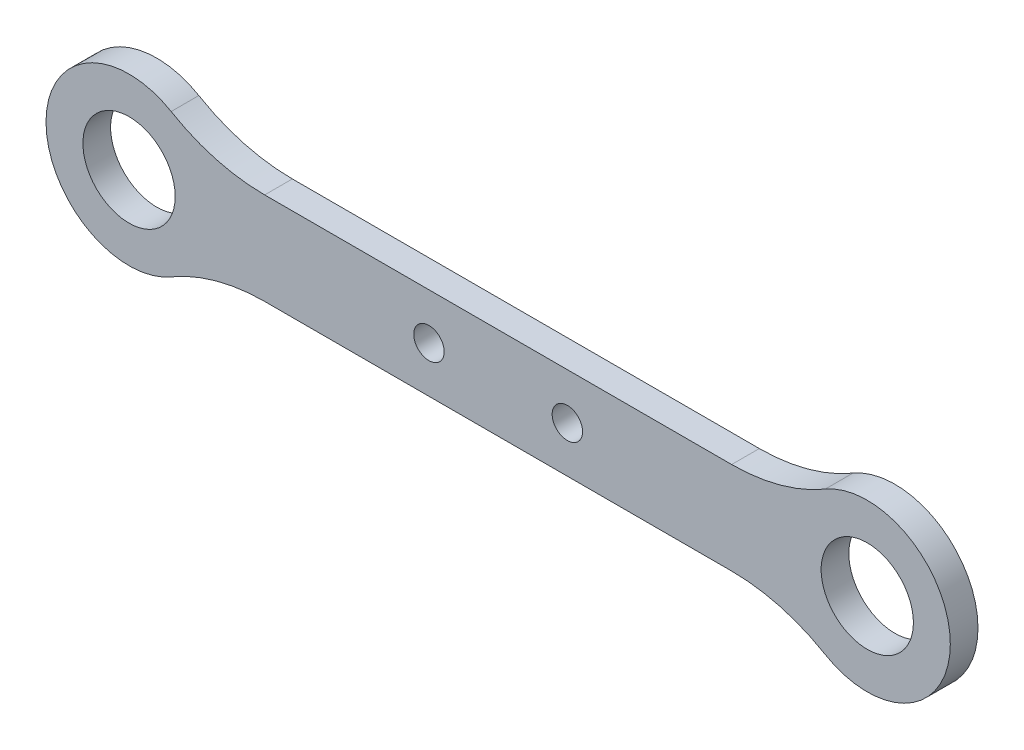
ISO-10303-21;
HEADER;
FILE_DESCRIPTION(('STEP AP214'),'2;1');
FILE_NAME('part.step','',(''),(''),'','','');
FILE_SCHEMA(('AUTOMOTIVE_DESIGN { 1 0 10303 214 1 1 1 1 }'));
ENDSEC;
DATA;
#1=APPLICATION_CONTEXT('core data for automotive mechanical design processes');
#2=APPLICATION_PROTOCOL_DEFINITION('international standard','automotive_design',2000,#1);
#3=PRODUCT_CONTEXT('',#1,'mechanical');
#4=PRODUCT('Part','Part','',(#3));
#5=PRODUCT_RELATED_PRODUCT_CATEGORY('part','',(#4));
#6=PRODUCT_DEFINITION_FORMATION('','',#4);
#7=PRODUCT_DEFINITION_CONTEXT('part definition',#1,'design');
#8=PRODUCT_DEFINITION('design','',#6,#7);
#9=PRODUCT_DEFINITION_SHAPE('','',#8);
#10=(LENGTH_UNIT() NAMED_UNIT(*) SI_UNIT(.MILLI.,.METRE.));
#11=(NAMED_UNIT(*) PLANE_ANGLE_UNIT() SI_UNIT($,.RADIAN.));
#12=(NAMED_UNIT(*) SI_UNIT($,.STERADIAN.) SOLID_ANGLE_UNIT());
#13=UNCERTAINTY_MEASURE_WITH_UNIT(LENGTH_MEASURE(1.E-05),#10,'distance_accuracy_value','');
#14=(GEOMETRIC_REPRESENTATION_CONTEXT(3) GLOBAL_UNCERTAINTY_ASSIGNED_CONTEXT((#13)) GLOBAL_UNIT_ASSIGNED_CONTEXT((#10,
#11,#12)) REPRESENTATION_CONTEXT('',''));
#15=CARTESIAN_POINT('',(0.,0.,0.));
#16=DIRECTION('',(0.,0.,1.));
#17=DIRECTION('',(1.,0.,0.));
#18=AXIS2_PLACEMENT_3D('',#15,#16,#17);
#19=CARTESIAN_POINT('',(80.,0.,3.));
#20=DIRECTION('',(0.,0.,-1.));
#21=DIRECTION('',(-1.,0.,0.));
#22=AXIS2_PLACEMENT_3D('',#19,#20,#21);
#23=CYLINDRICAL_SURFACE('',#22,9.);
#24=CARTESIAN_POINT('',(80.,0.,3.));
#25=DIRECTION('',(0.,0.,1.));
#26=DIRECTION('',(1.,0.,0.));
#27=AXIS2_PLACEMENT_3D('',#24,#25,#26);
#28=CIRCLE('',#27,9.);
#29=CARTESIAN_POINT('',(75.4388811686106,7.75862068965518,3.));
#30=VERTEX_POINT('',#29);
#31=CARTESIAN_POINT('',(75.4388811686106,-7.75862068965518,3.));
#32=VERTEX_POINT('',#31);
#33=EDGE_CURVE('E148',#30,#32,#28,.F.);
#34=ORIENTED_EDGE('',*,*,#33,.T.);
#35=DIRECTION('',(0.,0.,-1.));
#36=VECTOR('',#35,1.);
#37=CARTESIAN_POINT('',(75.4388811686106,-7.75862068965518,3.));
#38=LINE('',#37,#36);
#39=CARTESIAN_POINT('',(75.4388811686106,-7.75862068965518,0.));
#40=VERTEX_POINT('',#39);
#41=EDGE_CURVE('E156',#32,#40,#38,.T.);
#42=ORIENTED_EDGE('',*,*,#41,.T.);
#43=CARTESIAN_POINT('',(80.,0.,0.));
#44=DIRECTION('',(0.,0.,1.));
#45=DIRECTION('',(1.,0.,0.));
#46=AXIS2_PLACEMENT_3D('',#43,#44,#45);
#47=CIRCLE('',#46,9.);
#48=CARTESIAN_POINT('',(75.4388811686106,7.75862068965518,0.));
#49=VERTEX_POINT('',#48);
#50=EDGE_CURVE('E172',#49,#40,#47,.F.);
#51=ORIENTED_EDGE('',*,*,#50,.F.);
#52=DIRECTION('',(0.,0.,-1.));
#53=VECTOR('',#52,1.);
#54=CARTESIAN_POINT('',(75.4388811686106,7.75862068965518,3.));
#55=LINE('',#54,#53);
#56=EDGE_CURVE('E154',#49,#30,#55,.F.);
#57=ORIENTED_EDGE('',*,*,#56,.T.);
#58=EDGE_LOOP('',(#34,#42,#51,#57));
#59=FACE_BOUND('',#58,.T.);
#60=ADVANCED_FACE('F35',(#59),#23,.T.);
#61=CARTESIAN_POINT('',(0.,4.99999999999999,3.));
#62=DIRECTION('',(0.,1.,0.));
#63=DIRECTION('',(-1.,0.,0.));
#64=AXIS2_PLACEMENT_3D('',#61,#62,#63);
#65=PLANE('',#64);
#66=DIRECTION('',(1.,0.,0.));
#67=VECTOR('',#66,1.);
#68=CARTESIAN_POINT('',(0.,4.99999999999999,3.));
#69=LINE('',#68,#67);
#70=CARTESIAN_POINT('',(14.6969384566991,4.99999999999999,3.));
#71=VERTEX_POINT('',#70);
#72=CARTESIAN_POINT('',(65.3030615433009,5.,3.));
#73=VERTEX_POINT('',#72);
#74=EDGE_CURVE('E179',#71,#73,#69,.T.);
#75=ORIENTED_EDGE('',*,*,#74,.T.);
#76=DIRECTION('',(0.,0.,1.));
#77=VECTOR('',#76,1.);
#78=CARTESIAN_POINT('',(65.3030615433009,5.,0.));
#79=LINE('',#78,#77);
#80=CARTESIAN_POINT('',(65.3030615433009,5.,0.));
#81=VERTEX_POINT('',#80);
#82=EDGE_CURVE('E112',#73,#81,#79,.F.);
#83=ORIENTED_EDGE('',*,*,#82,.T.);
#84=DIRECTION('',(1.,0.,0.));
#85=VECTOR('',#84,1.);
#86=CARTESIAN_POINT('',(0.,4.99999999999999,0.));
#87=LINE('',#86,#85);
#88=CARTESIAN_POINT('',(14.6969384566991,4.99999999999999,0.));
#89=VERTEX_POINT('',#88);
#90=EDGE_CURVE('E136',#89,#81,#87,.T.);
#91=ORIENTED_EDGE('',*,*,#90,.F.);
#92=DIRECTION('',(0.,0.,-1.));
#93=VECTOR('',#92,1.);
#94=CARTESIAN_POINT('',(14.6969384566991,4.99999999999999,3.));
#95=LINE('',#94,#93);
#96=EDGE_CURVE('E57',#89,#71,#95,.F.);
#97=ORIENTED_EDGE('',*,*,#96,.T.);
#98=EDGE_LOOP('',(#75,#83,#91,#97));
#99=FACE_BOUND('',#98,.T.);
#100=ADVANCED_FACE('F170',(#99),#65,.T.);
#101=CARTESIAN_POINT('',(0.,0.,3.));
#102=DIRECTION('',(0.,0.,-1.));
#103=DIRECTION('',(-1.,0.,0.));
#104=AXIS2_PLACEMENT_3D('',#101,#102,#103);
#105=CYLINDRICAL_SURFACE('',#104,9.);
#106=CARTESIAN_POINT('',(0.,0.,0.));
#107=DIRECTION('',(0.,0.,1.));
#108=DIRECTION('',(1.,0.,0.));
#109=AXIS2_PLACEMENT_3D('',#106,#107,#108);
#110=CIRCLE('',#109,9.);
#111=CARTESIAN_POINT('',(4.56111883138937,7.75862068965517,0.));
#112=VERTEX_POINT('',#111);
#113=CARTESIAN_POINT('',(4.56111883138936,-7.75862068965518,0.));
#114=VERTEX_POINT('',#113);
#115=EDGE_CURVE('E131',#112,#114,#110,.T.);
#116=ORIENTED_EDGE('',*,*,#115,.T.);
#117=DIRECTION('',(0.,0.,-1.));
#118=VECTOR('',#117,1.);
#119=CARTESIAN_POINT('',(4.56111883138936,-7.75862068965518,3.));
#120=LINE('',#119,#118);
#121=CARTESIAN_POINT('',(4.56111883138936,-7.75862068965518,3.));
#122=VERTEX_POINT('',#121);
#123=EDGE_CURVE('E106',#114,#122,#120,.F.);
#124=ORIENTED_EDGE('',*,*,#123,.T.);
#125=CARTESIAN_POINT('',(0.,0.,3.));
#126=DIRECTION('',(0.,0.,1.));
#127=DIRECTION('',(1.,0.,0.));
#128=AXIS2_PLACEMENT_3D('',#125,#126,#127);
#129=CIRCLE('',#128,9.);
#130=CARTESIAN_POINT('',(4.56111883138937,7.75862068965517,3.));
#131=VERTEX_POINT('',#130);
#132=EDGE_CURVE('E178',#131,#122,#129,.T.);
#133=ORIENTED_EDGE('',*,*,#132,.F.);
#134=DIRECTION('',(0.,0.,-1.));
#135=VECTOR('',#134,1.);
#136=CARTESIAN_POINT('',(4.56111883138937,7.75862068965517,3.));
#137=LINE('',#136,#135);
#138=EDGE_CURVE('E122',#131,#112,#137,.T.);
#139=ORIENTED_EDGE('',*,*,#138,.T.);
#140=EDGE_LOOP('',(#116,#124,#133,#139));
#141=FACE_BOUND('',#140,.T.);
#142=ADVANCED_FACE('F181',(#141),#105,.T.);
#143=CARTESIAN_POINT('',(47.5,0.,3.));
#144=DIRECTION('',(0.,0.,-1.));
#145=DIRECTION('',(-1.,0.,0.));
#146=AXIS2_PLACEMENT_3D('',#143,#144,#145);
#147=CYLINDRICAL_SURFACE('',#146,1.65);
#148=CARTESIAN_POINT('',(47.5,0.,3.));
#149=DIRECTION('',(0.,0.,1.));
#150=DIRECTION('',(1.,0.,0.));
#151=AXIS2_PLACEMENT_3D('',#148,#149,#150);
#152=CIRCLE('',#151,1.65);
#153=CARTESIAN_POINT('',(49.15,0.,3.));
#154=VERTEX_POINT('',#153);
#155=EDGE_CURVE('E193',#154,#154,#152,.T.);
#156=ORIENTED_EDGE('',*,*,#155,.T.);
#157=EDGE_LOOP('',(#156));
#158=FACE_BOUND('',#157,.T.);
#159=CARTESIAN_POINT('',(47.5,0.,0.));
#160=DIRECTION('',(0.,0.,1.));
#161=DIRECTION('',(1.,0.,0.));
#162=AXIS2_PLACEMENT_3D('',#159,#160,#161);
#163=CIRCLE('',#162,1.65);
#164=CARTESIAN_POINT('',(49.15,0.,0.));
#165=VERTEX_POINT('',#164);
#166=EDGE_CURVE('E142',#165,#165,#163,.T.);
#167=ORIENTED_EDGE('',*,*,#166,.F.);
#168=EDGE_LOOP('',(#167));
#169=FACE_BOUND('',#168,.T.);
#170=ADVANCED_FACE('F235',(#158,#169),#147,.F.);
#171=CARTESIAN_POINT('',(32.5,0.,3.));
#172=DIRECTION('',(0.,0.,-1.));
#173=DIRECTION('',(-1.,0.,0.));
#174=AXIS2_PLACEMENT_3D('',#171,#172,#173);
#175=CYLINDRICAL_SURFACE('',#174,1.65);
#176=CARTESIAN_POINT('',(32.5,0.,3.));
#177=DIRECTION('',(0.,0.,1.));
#178=DIRECTION('',(1.,0.,0.));
#179=AXIS2_PLACEMENT_3D('',#176,#177,#178);
#180=CIRCLE('',#179,1.65);
#181=CARTESIAN_POINT('',(34.15,0.,3.));
#182=VERTEX_POINT('',#181);
#183=EDGE_CURVE('E190',#182,#182,#180,.T.);
#184=ORIENTED_EDGE('',*,*,#183,.T.);
#185=EDGE_LOOP('',(#184));
#186=FACE_BOUND('',#185,.T.);
#187=CARTESIAN_POINT('',(32.5,0.,0.));
#188=DIRECTION('',(0.,0.,1.));
#189=DIRECTION('',(1.,0.,0.));
#190=AXIS2_PLACEMENT_3D('',#187,#188,#189);
#191=CIRCLE('',#190,1.65);
#192=CARTESIAN_POINT('',(34.15,0.,0.));
#193=VERTEX_POINT('',#192);
#194=EDGE_CURVE('E134',#193,#193,#191,.T.);
#195=ORIENTED_EDGE('',*,*,#194,.F.);
#196=EDGE_LOOP('',(#195));
#197=FACE_BOUND('',#196,.T.);
#198=ADVANCED_FACE('F238',(#186,#197),#175,.F.);
#199=CARTESIAN_POINT('',(0.,0.,3.));
#200=DIRECTION('',(0.,0.,-1.));
#201=DIRECTION('',(-1.,0.,0.));
#202=AXIS2_PLACEMENT_3D('',#199,#200,#201);
#203=CYLINDRICAL_SURFACE('',#202,5.);
#204=CARTESIAN_POINT('',(0.,0.,3.));
#205=DIRECTION('',(0.,0.,1.));
#206=DIRECTION('',(1.,0.,0.));
#207=AXIS2_PLACEMENT_3D('',#204,#205,#206);
#208=CIRCLE('',#207,5.);
#209=CARTESIAN_POINT('',(5.,0.,3.));
#210=VERTEX_POINT('',#209);
#211=EDGE_CURVE('E183',#210,#210,#208,.T.);
#212=ORIENTED_EDGE('',*,*,#211,.T.);
#213=EDGE_LOOP('',(#212));
#214=FACE_BOUND('',#213,.T.);
#215=CARTESIAN_POINT('',(0.,0.,0.));
#216=DIRECTION('',(0.,0.,1.));
#217=DIRECTION('',(1.,0.,0.));
#218=AXIS2_PLACEMENT_3D('',#215,#216,#217);
#219=CIRCLE('',#218,5.);
#220=CARTESIAN_POINT('',(5.,0.,0.));
#221=VERTEX_POINT('',#220);
#222=EDGE_CURVE('E130',#221,#221,#219,.T.);
#223=ORIENTED_EDGE('',*,*,#222,.F.);
#224=EDGE_LOOP('',(#223));
#225=FACE_BOUND('',#224,.T.);
#226=ADVANCED_FACE('F242',(#214,#225),#203,.F.);
#227=CARTESIAN_POINT('',(0.,-5.00000000000001,3.));
#228=DIRECTION('',(0.,1.,0.));
#229=DIRECTION('',(-1.,0.,0.));
#230=AXIS2_PLACEMENT_3D('',#227,#228,#229);
#231=PLANE('',#230);
#232=DIRECTION('',(1.,0.,0.));
#233=VECTOR('',#232,1.);
#234=CARTESIAN_POINT('',(0.,-5.00000000000001,3.));
#235=LINE('',#234,#233);
#236=CARTESIAN_POINT('',(14.696938456699,-5.00000000000001,3.));
#237=VERTEX_POINT('',#236);
#238=CARTESIAN_POINT('',(65.3030615433009,-5.,3.));
#239=VERTEX_POINT('',#238);
#240=EDGE_CURVE('E121',#237,#239,#235,.T.);
#241=ORIENTED_EDGE('',*,*,#240,.F.);
#242=DIRECTION('',(0.,0.,1.));
#243=VECTOR('',#242,1.);
#244=CARTESIAN_POINT('',(14.696938456699,-5.00000000000001,0.));
#245=LINE('',#244,#243);
#246=CARTESIAN_POINT('',(14.696938456699,-5.00000000000001,0.));
#247=VERTEX_POINT('',#246);
#248=EDGE_CURVE('E105',#237,#247,#245,.F.);
#249=ORIENTED_EDGE('',*,*,#248,.T.);
#250=DIRECTION('',(1.,0.,0.));
#251=VECTOR('',#250,1.);
#252=CARTESIAN_POINT('',(0.,-5.00000000000001,0.));
#253=LINE('',#252,#251);
#254=CARTESIAN_POINT('',(65.3030615433009,-5.,0.));
#255=VERTEX_POINT('',#254);
#256=EDGE_CURVE('E118',#247,#255,#253,.T.);
#257=ORIENTED_EDGE('',*,*,#256,.T.);
#258=DIRECTION('',(0.,0.,-1.));
#259=VECTOR('',#258,1.);
#260=CARTESIAN_POINT('',(65.3030615433009,-5.,3.));
#261=LINE('',#260,#259);
#262=EDGE_CURVE('E123',#255,#239,#261,.F.);
#263=ORIENTED_EDGE('',*,*,#262,.T.);
#264=EDGE_LOOP('',(#241,#249,#257,#263));
#265=FACE_BOUND('',#264,.T.);
#266=ADVANCED_FACE('F117',(#265),#231,.F.);
#267=CARTESIAN_POINT('',(80.,0.,3.));
#268=DIRECTION('',(0.,0.,-1.));
#269=DIRECTION('',(-1.,0.,0.));
#270=AXIS2_PLACEMENT_3D('',#267,#268,#269);
#271=CYLINDRICAL_SURFACE('',#270,5.);
#272=CARTESIAN_POINT('',(80.,0.,3.));
#273=DIRECTION('',(0.,0.,1.));
#274=DIRECTION('',(1.,0.,0.));
#275=AXIS2_PLACEMENT_3D('',#272,#273,#274);
#276=CIRCLE('',#275,5.);
#277=CARTESIAN_POINT('',(85.,0.,3.));
#278=VERTEX_POINT('',#277);
#279=EDGE_CURVE('E149',#278,#278,#276,.F.);
#280=ORIENTED_EDGE('',*,*,#279,.F.);
#281=EDGE_LOOP('',(#280));
#282=FACE_BOUND('',#281,.T.);
#283=CARTESIAN_POINT('',(80.,0.,0.));
#284=DIRECTION('',(0.,0.,1.));
#285=DIRECTION('',(1.,0.,0.));
#286=AXIS2_PLACEMENT_3D('',#283,#284,#285);
#287=CIRCLE('',#286,5.);
#288=CARTESIAN_POINT('',(85.,0.,0.));
#289=VERTEX_POINT('',#288);
#290=EDGE_CURVE('E145',#289,#289,#287,.F.);
#291=ORIENTED_EDGE('',*,*,#290,.T.);
#292=EDGE_LOOP('',(#291));
#293=FACE_BOUND('',#292,.T.);
#294=ADVANCED_FACE('F229',(#282,#293),#271,.F.);
#295=CARTESIAN_POINT('',(0.,0.,3.));
#296=DIRECTION('',(0.,0.,1.));
#297=DIRECTION('',(1.,0.,0.));
#298=AXIS2_PLACEMENT_3D('',#295,#296,#297);
#299=PLANE('',#298);
#300=ORIENTED_EDGE('',*,*,#33,.F.);
#301=CARTESIAN_POINT('',(65.3030615433009,25.,3.));
#302=DIRECTION('',(0.,0.,1.));
#303=DIRECTION('',(1.,0.,0.));
#304=AXIS2_PLACEMENT_3D('',#301,#302,#303);
#305=CIRCLE('',#304,20.);
#306=EDGE_CURVE('E50',#30,#73,#305,.F.);
#307=ORIENTED_EDGE('',*,*,#306,.T.);
#308=ORIENTED_EDGE('',*,*,#74,.F.);
#309=CARTESIAN_POINT('',(14.6969384566991,25.,3.));
#310=DIRECTION('',(0.,0.,1.));
#311=DIRECTION('',(1.,0.,0.));
#312=AXIS2_PLACEMENT_3D('',#309,#310,#311);
#313=CIRCLE('',#312,20.);
#314=EDGE_CURVE('E11',#71,#131,#313,.F.);
#315=ORIENTED_EDGE('',*,*,#314,.T.);
#316=ORIENTED_EDGE('',*,*,#132,.T.);
#317=CARTESIAN_POINT('',(14.6969384566991,-25.,3.));
#318=DIRECTION('',(0.,0.,1.));
#319=DIRECTION('',(1.,0.,0.));
#320=AXIS2_PLACEMENT_3D('',#317,#318,#319);
#321=CIRCLE('',#320,20.);
#322=EDGE_CURVE('E111',#122,#237,#321,.F.);
#323=ORIENTED_EDGE('',*,*,#322,.T.);
#324=ORIENTED_EDGE('',*,*,#240,.T.);
#325=CARTESIAN_POINT('',(65.3030615433009,-25.,3.));
#326=DIRECTION('',(0.,0.,1.));
#327=DIRECTION('',(1.,0.,0.));
#328=AXIS2_PLACEMENT_3D('',#325,#326,#327);
#329=CIRCLE('',#328,20.);
#330=EDGE_CURVE('E164',#239,#32,#329,.F.);
#331=ORIENTED_EDGE('',*,*,#330,.T.);
#332=EDGE_LOOP('',(#300,#307,#308,#315,#316,#323,#324,#331));
#333=FACE_BOUND('',#332,.T.);
#334=ORIENTED_EDGE('',*,*,#211,.F.);
#335=EDGE_LOOP('',(#334));
#336=FACE_BOUND('',#335,.T.);
#337=ORIENTED_EDGE('',*,*,#183,.F.);
#338=EDGE_LOOP('',(#337));
#339=FACE_BOUND('',#338,.T.);
#340=ORIENTED_EDGE('',*,*,#155,.F.);
#341=EDGE_LOOP('',(#340));
#342=FACE_BOUND('',#341,.T.);
#343=ORIENTED_EDGE('',*,*,#279,.T.);
#344=EDGE_LOOP('',(#343));
#345=FACE_BOUND('',#344,.T.);
#346=ADVANCED_FACE('F176',(#333,#336,#339,#342,#345),#299,.T.);
#347=CARTESIAN_POINT('',(0.,0.,0.));
#348=DIRECTION('',(0.,0.,1.));
#349=DIRECTION('',(1.,0.,0.));
#350=AXIS2_PLACEMENT_3D('',#347,#348,#349);
#351=PLANE('',#350);
#352=ORIENTED_EDGE('',*,*,#90,.T.);
#353=CARTESIAN_POINT('',(65.3030615433009,25.,0.));
#354=DIRECTION('',(0.,0.,1.));
#355=DIRECTION('',(1.,0.,0.));
#356=AXIS2_PLACEMENT_3D('',#353,#354,#355);
#357=CIRCLE('',#356,20.);
#358=EDGE_CURVE('E166',#81,#49,#357,.T.);
#359=ORIENTED_EDGE('',*,*,#358,.T.);
#360=ORIENTED_EDGE('',*,*,#50,.T.);
#361=CARTESIAN_POINT('',(65.3030615433009,-25.,0.));
#362=DIRECTION('',(0.,0.,1.));
#363=DIRECTION('',(1.,0.,0.));
#364=AXIS2_PLACEMENT_3D('',#361,#362,#363);
#365=CIRCLE('',#364,20.);
#366=EDGE_CURVE('E129',#40,#255,#365,.T.);
#367=ORIENTED_EDGE('',*,*,#366,.T.);
#368=ORIENTED_EDGE('',*,*,#256,.F.);
#369=CARTESIAN_POINT('',(14.6969384566991,-25.,0.));
#370=DIRECTION('',(0.,0.,1.));
#371=DIRECTION('',(1.,0.,0.));
#372=AXIS2_PLACEMENT_3D('',#369,#370,#371);
#373=CIRCLE('',#372,20.);
#374=EDGE_CURVE('E101',#247,#114,#373,.T.);
#375=ORIENTED_EDGE('',*,*,#374,.T.);
#376=ORIENTED_EDGE('',*,*,#115,.F.);
#377=CARTESIAN_POINT('',(14.6969384566991,25.,0.));
#378=DIRECTION('',(0.,0.,1.));
#379=DIRECTION('',(1.,0.,0.));
#380=AXIS2_PLACEMENT_3D('',#377,#378,#379);
#381=CIRCLE('',#380,20.);
#382=EDGE_CURVE('E43',#112,#89,#381,.T.);
#383=ORIENTED_EDGE('',*,*,#382,.T.);
#384=EDGE_LOOP('',(#352,#359,#360,#367,#368,#375,#376,#383));
#385=FACE_BOUND('',#384,.T.);
#386=ORIENTED_EDGE('',*,*,#222,.T.);
#387=EDGE_LOOP('',(#386));
#388=FACE_BOUND('',#387,.T.);
#389=ORIENTED_EDGE('',*,*,#194,.T.);
#390=EDGE_LOOP('',(#389));
#391=FACE_BOUND('',#390,.T.);
#392=ORIENTED_EDGE('',*,*,#166,.T.);
#393=EDGE_LOOP('',(#392));
#394=FACE_BOUND('',#393,.T.);
#395=ORIENTED_EDGE('',*,*,#290,.F.);
#396=EDGE_LOOP('',(#395));
#397=FACE_BOUND('',#396,.T.);
#398=ADVANCED_FACE('F126',(#385,#388,#391,#394,#397),#351,.F.);
#399=CARTESIAN_POINT('',(14.6969384566991,-25.,3.));
#400=DIRECTION('',(0.,0.,-1.));
#401=DIRECTION('',(-1.,0.,0.));
#402=AXIS2_PLACEMENT_3D('',#399,#400,#401);
#403=CYLINDRICAL_SURFACE('',#402,20.);
#404=ORIENTED_EDGE('',*,*,#322,.F.);
#405=ORIENTED_EDGE('',*,*,#123,.F.);
#406=ORIENTED_EDGE('',*,*,#374,.F.);
#407=ORIENTED_EDGE('',*,*,#248,.F.);
#408=EDGE_LOOP('',(#404,#405,#406,#407));
#409=FACE_BOUND('',#408,.T.);
#410=ADVANCED_FACE('F104',(#409),#403,.F.);
#411=CARTESIAN_POINT('',(65.3030615433009,-25.,3.));
#412=DIRECTION('',(0.,0.,-1.));
#413=DIRECTION('',(-1.,0.,0.));
#414=AXIS2_PLACEMENT_3D('',#411,#412,#413);
#415=CYLINDRICAL_SURFACE('',#414,20.);
#416=ORIENTED_EDGE('',*,*,#330,.F.);
#417=ORIENTED_EDGE('',*,*,#262,.F.);
#418=ORIENTED_EDGE('',*,*,#366,.F.);
#419=ORIENTED_EDGE('',*,*,#41,.F.);
#420=EDGE_LOOP('',(#416,#417,#418,#419));
#421=FACE_BOUND('',#420,.T.);
#422=ADVANCED_FACE('F206',(#421),#415,.F.);
#423=CARTESIAN_POINT('',(65.3030615433009,25.,3.));
#424=DIRECTION('',(0.,0.,-1.));
#425=DIRECTION('',(-1.,0.,0.));
#426=AXIS2_PLACEMENT_3D('',#423,#424,#425);
#427=CYLINDRICAL_SURFACE('',#426,20.);
#428=ORIENTED_EDGE('',*,*,#306,.F.);
#429=ORIENTED_EDGE('',*,*,#56,.F.);
#430=ORIENTED_EDGE('',*,*,#358,.F.);
#431=ORIENTED_EDGE('',*,*,#82,.F.);
#432=EDGE_LOOP('',(#428,#429,#430,#431));
#433=FACE_BOUND('',#432,.T.);
#434=ADVANCED_FACE('F204',(#433),#427,.F.);
#435=CARTESIAN_POINT('',(14.6969384566991,25.,3.));
#436=DIRECTION('',(0.,0.,-1.));
#437=DIRECTION('',(-1.,0.,0.));
#438=AXIS2_PLACEMENT_3D('',#435,#436,#437);
#439=CYLINDRICAL_SURFACE('',#438,20.);
#440=ORIENTED_EDGE('',*,*,#314,.F.);
#441=ORIENTED_EDGE('',*,*,#96,.F.);
#442=ORIENTED_EDGE('',*,*,#382,.F.);
#443=ORIENTED_EDGE('',*,*,#138,.F.);
#444=EDGE_LOOP('',(#440,#441,#442,#443));
#445=FACE_BOUND('',#444,.T.);
#446=ADVANCED_FACE('F37',(#445),#439,.F.);
#447=CLOSED_SHELL('',(#60,#100,#142,#170,#198,#226,#266,#294,#346,#398,#410,#422,#434,#446));
#448=MANIFOLD_SOLID_BREP('B2',#447);
#449=ADVANCED_BREP_SHAPE_REPRESENTATION('',(#18,#448),#14);
#450=SHAPE_DEFINITION_REPRESENTATION(#9,#449);
ENDSEC;
END-ISO-10303-21;
